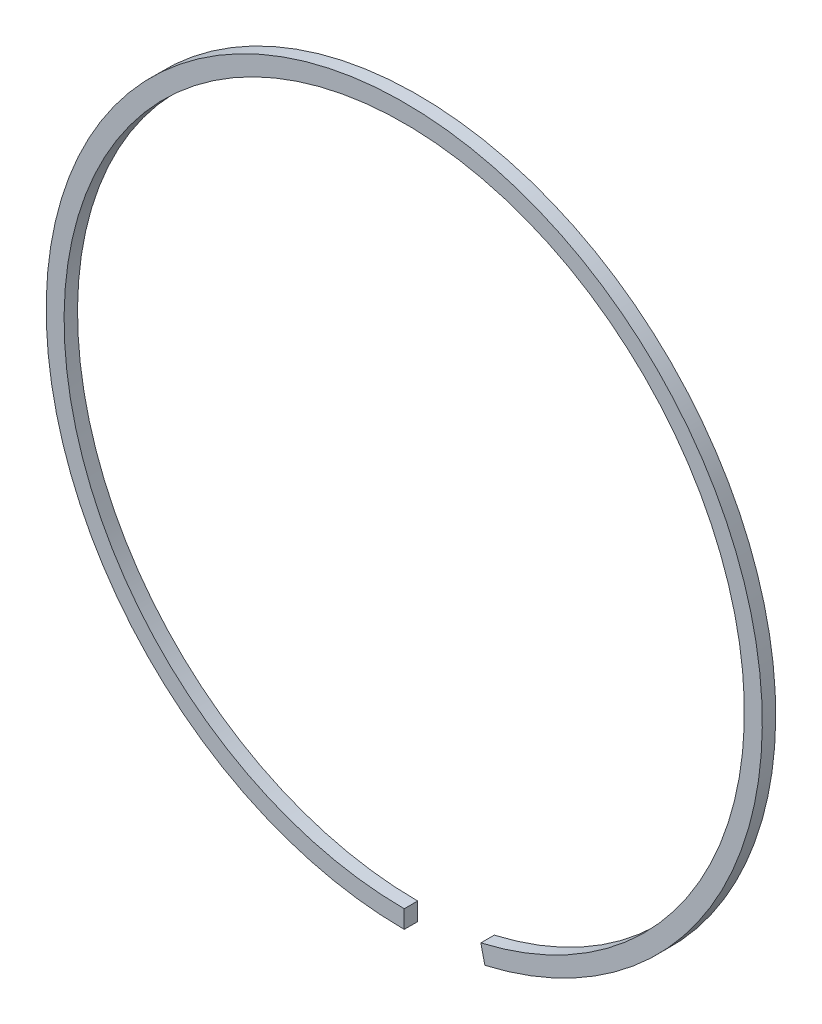
ISO-10303-21;
HEADER;
FILE_DESCRIPTION(('STEP AP214'),'2;1');
FILE_NAME('part.step','',(''),(''),'','','');
FILE_SCHEMA(('AUTOMOTIVE_DESIGN { 1 0 10303 214 1 1 1 1 }'));
ENDSEC;
DATA;
#1=APPLICATION_CONTEXT('core data for automotive mechanical design processes');
#2=APPLICATION_PROTOCOL_DEFINITION('international standard','automotive_design',2000,#1);
#3=PRODUCT_CONTEXT('',#1,'mechanical');
#4=PRODUCT('Part','Part','',(#3));
#5=PRODUCT_RELATED_PRODUCT_CATEGORY('part','',(#4));
#6=PRODUCT_DEFINITION_FORMATION('','',#4);
#7=PRODUCT_DEFINITION_CONTEXT('part definition',#1,'design');
#8=PRODUCT_DEFINITION('design','',#6,#7);
#9=PRODUCT_DEFINITION_SHAPE('','',#8);
#10=(LENGTH_UNIT() NAMED_UNIT(*) SI_UNIT(.MILLI.,.METRE.));
#11=(NAMED_UNIT(*) PLANE_ANGLE_UNIT() SI_UNIT($,.RADIAN.));
#12=(NAMED_UNIT(*) SI_UNIT($,.STERADIAN.) SOLID_ANGLE_UNIT());
#13=UNCERTAINTY_MEASURE_WITH_UNIT(LENGTH_MEASURE(1.E-05),#10,'distance_accuracy_value','');
#14=(GEOMETRIC_REPRESENTATION_CONTEXT(3) GLOBAL_UNCERTAINTY_ASSIGNED_CONTEXT((#13)) GLOBAL_UNIT_ASSIGNED_CONTEXT((#10,
#11,#12)) REPRESENTATION_CONTEXT('',''));
#15=CARTESIAN_POINT('',(0.,0.,0.));
#16=DIRECTION('',(0.,0.,1.));
#17=DIRECTION('',(1.,0.,0.));
#18=AXIS2_PLACEMENT_3D('',#15,#16,#17);
#19=CARTESIAN_POINT('',(0.,0.,1.5));
#20=DIRECTION('',(0.,0.,-1.));
#21=DIRECTION('',(-1.,0.,0.));
#22=AXIS2_PLACEMENT_3D('',#19,#20,#21);
#23=CYLINDRICAL_SURFACE('',#22,40.);
#24=CARTESIAN_POINT('',(0.,0.,0.));
#25=DIRECTION('',(0.,0.,1.));
#26=DIRECTION('',(1.,0.,0.));
#27=AXIS2_PLACEMENT_3D('',#24,#25,#26);
#28=CIRCLE('',#27,40.);
#29=CARTESIAN_POINT('',(9.00647793428544,-38.972854081004,0.));
#30=VERTEX_POINT('',#29);
#31=CARTESIAN_POINT('',(0.,-40.,0.));
#32=VERTEX_POINT('',#31);
#33=EDGE_CURVE('E97',#30,#32,#28,.T.);
#34=ORIENTED_EDGE('',*,*,#33,.T.);
#35=DIRECTION('',(0.,0.,-1.));
#36=VECTOR('',#35,1.);
#37=CARTESIAN_POINT('',(0.,-40.,1.5));
#38=LINE('',#37,#36);
#39=CARTESIAN_POINT('',(0.,-40.,1.5));
#40=VERTEX_POINT('',#39);
#41=EDGE_CURVE('E11',#40,#32,#38,.T.);
#42=ORIENTED_EDGE('',*,*,#41,.F.);
#43=CARTESIAN_POINT('',(0.,0.,1.5));
#44=DIRECTION('',(0.,0.,1.));
#45=DIRECTION('',(1.,0.,0.));
#46=AXIS2_PLACEMENT_3D('',#43,#44,#45);
#47=CIRCLE('',#46,40.);
#48=CARTESIAN_POINT('',(9.00647793428544,-38.972854081004,1.5));
#49=VERTEX_POINT('',#48);
#50=EDGE_CURVE('E85',#49,#40,#47,.T.);
#51=ORIENTED_EDGE('',*,*,#50,.F.);
#52=DIRECTION('',(0.,0.,-1.));
#53=VECTOR('',#52,1.);
#54=CARTESIAN_POINT('',(9.00647793428544,-38.972854081004,1.5));
#55=LINE('',#54,#53);
#56=EDGE_CURVE('E93',#49,#30,#55,.T.);
#57=ORIENTED_EDGE('',*,*,#56,.T.);
#58=EDGE_LOOP('',(#34,#42,#51,#57));
#59=FACE_BOUND('',#58,.T.);
#60=ADVANCED_FACE('F34',(#59),#23,.T.);
#61=CARTESIAN_POINT('',(0.,-38.,1.5));
#62=DIRECTION('',(-1.,0.,0.));
#63=DIRECTION('',(0.,0.,1.));
#64=AXIS2_PLACEMENT_3D('',#61,#62,#63);
#65=PLANE('',#64);
#66=DIRECTION('',(0.,1.,0.));
#67=VECTOR('',#66,1.);
#68=CARTESIAN_POINT('',(0.,-38.,0.));
#69=LINE('',#68,#67);
#70=CARTESIAN_POINT('',(0.,-38.,0.));
#71=VERTEX_POINT('',#70);
#72=EDGE_CURVE('E89',#32,#71,#69,.T.);
#73=ORIENTED_EDGE('',*,*,#72,.T.);
#74=DIRECTION('',(0.,0.,-1.));
#75=VECTOR('',#74,1.);
#76=CARTESIAN_POINT('',(0.,-38.,1.5));
#77=LINE('',#76,#75);
#78=CARTESIAN_POINT('',(0.,-38.,1.5));
#79=VERTEX_POINT('',#78);
#80=EDGE_CURVE('E42',#79,#71,#77,.T.);
#81=ORIENTED_EDGE('',*,*,#80,.F.);
#82=DIRECTION('',(0.,1.,0.));
#83=VECTOR('',#82,1.);
#84=CARTESIAN_POINT('',(0.,-38.,1.5));
#85=LINE('',#84,#83);
#86=EDGE_CURVE('E80',#40,#79,#85,.T.);
#87=ORIENTED_EDGE('',*,*,#86,.F.);
#88=ORIENTED_EDGE('',*,*,#41,.T.);
#89=EDGE_LOOP('',(#73,#81,#87,#88));
#90=FACE_BOUND('',#89,.T.);
#91=ADVANCED_FACE('F88',(#90),#65,.F.);
#92=CARTESIAN_POINT('',(0.,0.,1.5));
#93=DIRECTION('',(0.,0.,-1.));
#94=DIRECTION('',(-1.,0.,0.));
#95=AXIS2_PLACEMENT_3D('',#92,#93,#94);
#96=CYLINDRICAL_SURFACE('',#95,38.);
#97=CARTESIAN_POINT('',(0.,0.,0.));
#98=DIRECTION('',(0.,0.,-1.));
#99=DIRECTION('',(1.,0.,0.));
#100=AXIS2_PLACEMENT_3D('',#97,#98,#99);
#101=CIRCLE('',#100,38.);
#102=CARTESIAN_POINT('',(8.55615403757115,-37.0242113769538,0.));
#103=VERTEX_POINT('',#102);
#104=EDGE_CURVE('E67',#71,#103,#101,.T.);
#105=ORIENTED_EDGE('',*,*,#104,.T.);
#106=DIRECTION('',(0.,0.,-1.));
#107=VECTOR('',#106,1.);
#108=CARTESIAN_POINT('',(8.55615403757115,-37.0242113769538,1.5));
#109=LINE('',#108,#107);
#110=CARTESIAN_POINT('',(8.55615403757115,-37.0242113769538,1.5));
#111=VERTEX_POINT('',#110);
#112=EDGE_CURVE('E90',#111,#103,#109,.T.);
#113=ORIENTED_EDGE('',*,*,#112,.F.);
#114=CARTESIAN_POINT('',(0.,0.,1.5));
#115=DIRECTION('',(0.,0.,-1.));
#116=DIRECTION('',(1.,0.,0.));
#117=AXIS2_PLACEMENT_3D('',#114,#115,#116);
#118=CIRCLE('',#117,38.);
#119=EDGE_CURVE('E83',#79,#111,#118,.T.);
#120=ORIENTED_EDGE('',*,*,#119,.F.);
#121=ORIENTED_EDGE('',*,*,#80,.T.);
#122=EDGE_LOOP('',(#105,#113,#120,#121));
#123=FACE_BOUND('',#122,.T.);
#124=ADVANCED_FACE('F91',(#123),#96,.F.);
#125=CARTESIAN_POINT('',(8.55615403757117,-37.0242113769538,1.5));
#126=DIRECTION('',(0.9743213520251,0.225161948357136,0.));
#127=DIRECTION('',(-0.225161948357136,0.9743213520251,0.));
#128=AXIS2_PLACEMENT_3D('',#125,#126,#127);
#129=PLANE('',#128);
#130=DIRECTION('',(0.225161948357136,-0.9743213520251,0.));
#131=VECTOR('',#130,1.);
#132=CARTESIAN_POINT('',(8.55615403757117,-37.0242113769538,0.));
#133=LINE('',#132,#131);
#134=EDGE_CURVE('E73',#103,#30,#133,.T.);
#135=ORIENTED_EDGE('',*,*,#134,.T.);
#136=ORIENTED_EDGE('',*,*,#56,.F.);
#137=DIRECTION('',(0.225161948357136,-0.9743213520251,0.));
#138=VECTOR('',#137,1.);
#139=CARTESIAN_POINT('',(8.55615403757117,-37.0242113769538,1.5));
#140=LINE('',#139,#138);
#141=EDGE_CURVE('E50',#111,#49,#140,.T.);
#142=ORIENTED_EDGE('',*,*,#141,.F.);
#143=ORIENTED_EDGE('',*,*,#112,.T.);
#144=EDGE_LOOP('',(#135,#136,#142,#143));
#145=FACE_BOUND('',#144,.T.);
#146=ADVANCED_FACE('F104',(#145),#129,.F.);
#147=CARTESIAN_POINT('',(0.,0.,1.5));
#148=DIRECTION('',(0.,0.,1.));
#149=DIRECTION('',(1.,0.,0.));
#150=AXIS2_PLACEMENT_3D('',#147,#148,#149);
#151=PLANE('',#150);
#152=ORIENTED_EDGE('',*,*,#50,.T.);
#153=ORIENTED_EDGE('',*,*,#86,.T.);
#154=ORIENTED_EDGE('',*,*,#119,.T.);
#155=ORIENTED_EDGE('',*,*,#141,.T.);
#156=EDGE_LOOP('',(#152,#153,#154,#155));
#157=FACE_BOUND('',#156,.T.);
#158=ADVANCED_FACE('F81',(#157),#151,.T.);
#159=CARTESIAN_POINT('',(0.,0.,0.));
#160=DIRECTION('',(0.,0.,1.));
#161=DIRECTION('',(1.,0.,0.));
#162=AXIS2_PLACEMENT_3D('',#159,#160,#161);
#163=PLANE('',#162);
#164=ORIENTED_EDGE('',*,*,#33,.F.);
#165=ORIENTED_EDGE('',*,*,#134,.F.);
#166=ORIENTED_EDGE('',*,*,#104,.F.);
#167=ORIENTED_EDGE('',*,*,#72,.F.);
#168=EDGE_LOOP('',(#164,#165,#166,#167));
#169=FACE_BOUND('',#168,.T.);
#170=ADVANCED_FACE('F107',(#169),#163,.F.);
#171=CLOSED_SHELL('',(#60,#91,#124,#146,#158,#170));
#172=MANIFOLD_SOLID_BREP('B2',#171);
#173=ADVANCED_BREP_SHAPE_REPRESENTATION('',(#18,#172),#14);
#174=SHAPE_DEFINITION_REPRESENTATION(#9,#173);
ENDSEC;
END-ISO-10303-21;
